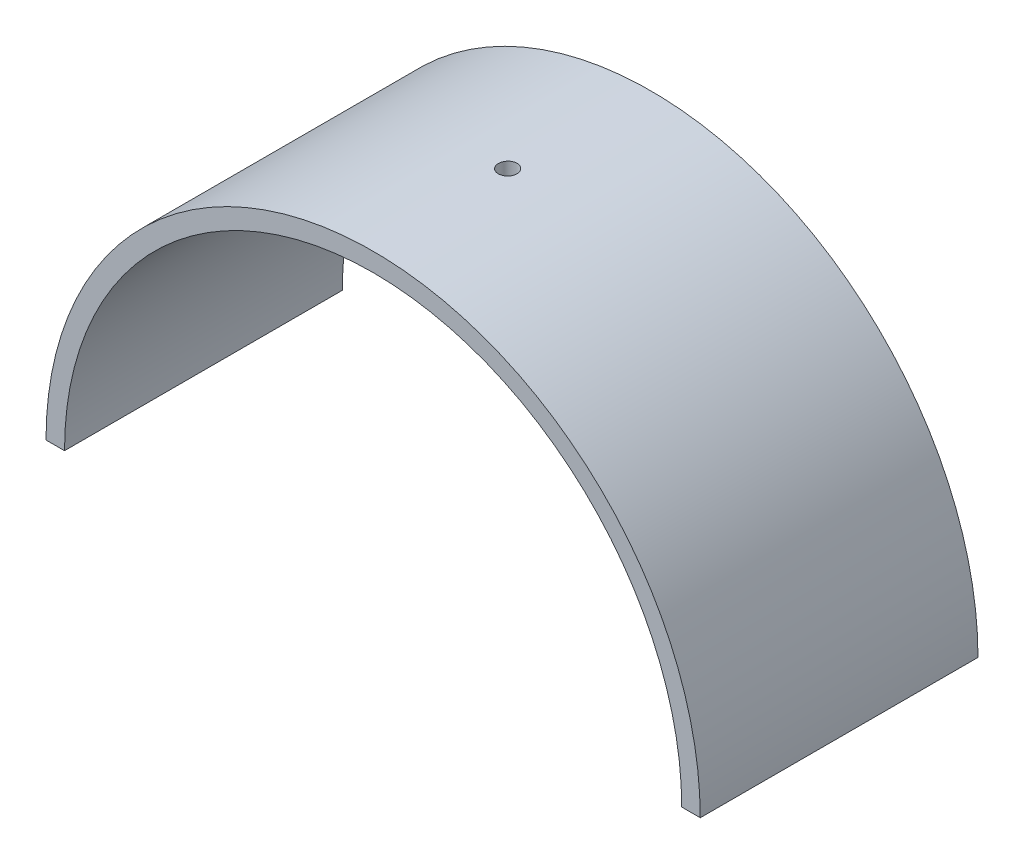
ISO-10303-21;
HEADER;
FILE_DESCRIPTION(('STEP AP214'),'2;1');
FILE_NAME('part.step','',(''),(''),'','','');
FILE_SCHEMA(('AUTOMOTIVE_DESIGN { 1 0 10303 214 1 1 1 1 }'));
ENDSEC;
DATA;
#1=APPLICATION_CONTEXT('core data for automotive mechanical design processes');
#2=APPLICATION_PROTOCOL_DEFINITION('international standard','automotive_design',2000,#1);
#3=PRODUCT_CONTEXT('',#1,'mechanical');
#4=PRODUCT('Part','Part','',(#3));
#5=PRODUCT_RELATED_PRODUCT_CATEGORY('part','',(#4));
#6=PRODUCT_DEFINITION_FORMATION('','',#4);
#7=PRODUCT_DEFINITION_CONTEXT('part definition',#1,'design');
#8=PRODUCT_DEFINITION('design','',#6,#7);
#9=PRODUCT_DEFINITION_SHAPE('','',#8);
#10=(LENGTH_UNIT() NAMED_UNIT(*) SI_UNIT(.MILLI.,.METRE.));
#11=(NAMED_UNIT(*) PLANE_ANGLE_UNIT() SI_UNIT($,.RADIAN.));
#12=(NAMED_UNIT(*) SI_UNIT($,.STERADIAN.) SOLID_ANGLE_UNIT());
#13=UNCERTAINTY_MEASURE_WITH_UNIT(LENGTH_MEASURE(1.E-05),#10,'distance_accuracy_value','');
#14=(GEOMETRIC_REPRESENTATION_CONTEXT(3) GLOBAL_UNCERTAINTY_ASSIGNED_CONTEXT((#13)) GLOBAL_UNIT_ASSIGNED_CONTEXT((#10,
#11,#12)) REPRESENTATION_CONTEXT('',''));
#15=CARTESIAN_POINT('',(0.,0.,0.));
#16=DIRECTION('',(0.,0.,1.));
#17=DIRECTION('',(1.,0.,0.));
#18=AXIS2_PLACEMENT_3D('',#15,#16,#17);
#19=CARTESIAN_POINT('',(-51.5,0.,-27.8343249485573));
#20=DIRECTION('',(0.,0.,-1.));
#21=DIRECTION('',(-1.,0.,0.));
#22=AXIS2_PLACEMENT_3D('',#19,#20,#21);
#23=CYLINDRICAL_SURFACE('',#22,53.);
#24=CARTESIAN_POINT('',(-52.2035451664015,52.9953302112444,1.5));
#25=CARTESIAN_POINT('',(-52.287808076425,52.9942112833112,1.49999626657205));
#26=CARTESIAN_POINT('',(-52.3721290794447,52.9928889966438,1.49287592440333));
#27=CARTESIAN_POINT('',(-52.5384421990418,52.9898912907182,1.46457347770081));
#28=CARTESIAN_POINT('',(-52.6204313978558,52.9882154493729,1.44337449999846));
#29=CARTESIAN_POINT('',(-52.7796478266655,52.9846094620955,1.38752165949672));
#30=CARTESIAN_POINT('',(-52.8568773992233,52.9826794427543,1.35287447782762));
#31=CARTESIAN_POINT('',(-53.0044008015459,52.9786960062936,1.2711182135689));
#32=CARTESIAN_POINT('',(-53.0746963256784,52.9766426195178,1.22401218576601));
#33=CARTESIAN_POINT('',(-53.2064148182024,52.9725636524948,1.11864570661175));
#34=CARTESIAN_POINT('',(-53.2678337831578,52.9705380851648,1.06038024959755));
#35=CARTESIAN_POINT('',(-53.3800203893353,52.9666752062266,0.934357180430867));
#36=CARTESIAN_POINT('',(-53.4307876162332,52.9648379019427,0.866599199215464));
#37=CARTESIAN_POINT('',(-53.520221696735,52.9615021906314,0.723519105316563));
#38=CARTESIAN_POINT('',(-53.5588894776458,52.9600037576351,0.648197572891805));
#39=CARTESIAN_POINT('',(-53.6230282395587,52.9574714965208,0.492123867219286));
#40=CARTESIAN_POINT('',(-53.6484993048682,52.9564376654345,0.411371728668819));
#41=CARTESIAN_POINT('',(-53.6855048254691,52.9549234257782,0.246789061139623));
#42=CARTESIAN_POINT('',(-53.6970489788023,52.9544426321101,0.162960716248393));
#43=CARTESIAN_POINT('',(-53.7059033182207,52.954074547018,-0.00544534766046931));
#44=CARTESIAN_POINT('',(-53.7032135851561,52.9541872522229,-0.0900230624188573));
#45=CARTESIAN_POINT('',(-53.6836826257025,52.9549962100127,-0.257477917744125));
#46=CARTESIAN_POINT('',(-53.6668492127916,52.9556921404023,-0.340355971374241));
#47=CARTESIAN_POINT('',(-53.6195211410663,52.957607445625,-0.502108603759159));
#48=CARTESIAN_POINT('',(-53.5890264484534,52.958826821753,-0.58098317260869));
#49=CARTESIAN_POINT('',(-53.5152335014231,52.9616860653184,-0.732514470051274));
#50=CARTESIAN_POINT('',(-53.4719317709818,52.9633260468984,-0.805169503656206));
#51=CARTESIAN_POINT('',(-53.3737575804674,52.9668900079135,-0.94218129863256));
#52=CARTESIAN_POINT('',(-53.3188850704238,52.968813988575,-1.00653802416424));
#53=CARTESIAN_POINT('',(-53.1990787237241,52.9727922420841,-1.12517800622718));
#54=CARTESIAN_POINT('',(-53.1341372823863,52.9748466127117,-1.17945358017992));
#55=CARTESIAN_POINT('',(-52.9960639822766,52.9789255714166,-1.27633320138429));
#56=CARTESIAN_POINT('',(-52.9229321037941,52.9809501594223,-1.31893722054717));
#57=CARTESIAN_POINT('',(-52.770523430198,52.9848240192361,-1.39127763624885));
#58=CARTESIAN_POINT('',(-52.6912445034965,52.9866732297305,-1.42100954543389));
#59=CARTESIAN_POINT('',(-52.528813466323,52.9900758363333,-1.46673760782664));
#60=CARTESIAN_POINT('',(-52.4456613642062,52.9916292330797,-1.48273379066316));
#61=CARTESIAN_POINT('',(-52.2778750180686,52.9943576818946,-1.50052984144469));
#62=CARTESIAN_POINT('',(-52.1932413049227,52.9955328666683,-1.50233469399686));
#63=CARTESIAN_POINT('',(-52.0248678023833,52.9974678937722,-1.49170707197935));
#64=CARTESIAN_POINT('',(-51.9411280105138,52.9982277372532,-1.47927463685429));
#65=CARTESIAN_POINT('',(-51.7769613848486,52.9993399122833,-1.44053318383438));
#66=CARTESIAN_POINT('',(-51.6965330091322,52.9996924356139,-1.41423070497407));
#67=CARTESIAN_POINT('',(-51.541231323899,53.0000409042563,-1.34849923229043));
#68=CARTESIAN_POINT('',(-51.4663580130335,53.0000368496547,-1.30907024165442));
#69=CARTESIAN_POINT('',(-51.3242946239401,52.9997564222239,-1.21820678619799));
#70=CARTESIAN_POINT('',(-51.2571042497749,52.9994800598876,-1.16677278402813));
#71=CARTESIAN_POINT('',(-51.1323093900185,52.9987613609097,-1.05335801448023));
#72=CARTESIAN_POINT('',(-51.0747049221689,52.9983190239608,-0.991377227582533));
#73=CARTESIAN_POINT('',(-50.9707031243774,52.9973825596723,-0.858611091080073));
#74=CARTESIAN_POINT('',(-50.9243084966751,52.996888419886,-0.787823624758254));
#75=CARTESIAN_POINT('',(-50.8440608835868,52.9959560839993,-0.639464620348494));
#76=CARTESIAN_POINT('',(-50.8102078884307,52.9955178878552,-0.561893087545506));
#77=CARTESIAN_POINT('',(-50.7560022893301,52.9947847192536,-0.402160824188399));
#78=CARTESIAN_POINT('',(-50.7356507548095,52.9944897581421,-0.319999730662943));
#79=CARTESIAN_POINT('',(-50.70903046734,52.9940991725078,-0.153426357672677));
#80=CARTESIAN_POINT('',(-50.7027617293769,52.9940035481972,-0.069014075812441));
#81=CARTESIAN_POINT('',(-50.7044850932602,52.9940294428723,0.0996557890975757));
#82=CARTESIAN_POINT('',(-50.7124756871917,52.9941509388977,0.183913387561822));
#83=CARTESIAN_POINT('',(-50.7424878327766,52.9945883794121,0.349891146834266));
#84=CARTESIAN_POINT('',(-50.7645094154226,52.9949043243308,0.431611302037196));
#85=CARTESIAN_POINT('',(-50.8219586855843,52.9956703866799,0.590196030829827));
#86=CARTESIAN_POINT('',(-50.8573866221805,52.9961205066032,0.667060514173647));
#87=CARTESIAN_POINT('',(-50.940641573015,52.9970644808907,0.813748306073337));
#88=CARTESIAN_POINT('',(-50.9884681163551,52.9975583335935,0.883571881902545));
#89=CARTESIAN_POINT('',(-51.095163223192,52.998480594652,1.01420005030064));
#90=CARTESIAN_POINT('',(-51.1540317940102,52.9989090029644,1.07500463688938));
#91=CARTESIAN_POINT('',(-51.2811593457515,52.9995862266722,1.18588314722011));
#92=CARTESIAN_POINT('',(-51.3494206347037,52.9998349978319,1.23595442575687));
#93=CARTESIAN_POINT('',(-51.4934019311959,53.0000484702756,1.32394134498786));
#94=CARTESIAN_POINT('',(-51.5691248797388,53.0000130591036,1.36185216740115));
#95=CARTESIAN_POINT('',(-51.7258005164037,52.9995766527104,1.42437990875735));
#96=CARTESIAN_POINT('',(-51.80674683252,52.9991760953815,1.44901269475014));
#97=CARTESIAN_POINT('',(-51.9407621582688,52.9981925317537,1.4777487160451));
#98=CARTESIAN_POINT('',(-51.992962864912,52.9977333755274,1.48608264024125));
#99=CARTESIAN_POINT('',(-52.0979498308258,52.9966528413397,1.49720945102635));
#100=CARTESIAN_POINT('',(-52.1507360898648,52.9960314634424,1.50000233980624));
#101=CARTESIAN_POINT('',(-52.2035451664015,52.9953302112444,1.5));
#102=B_SPLINE_CURVE_WITH_KNOTS('',3,(#24,#25,#26,#27,#28,#29,#30,#31,#32,#33,#34,#35,#36,#37,
#38,#39,#40,#41,#42,#43,#44,#45,#46,#47,#48,#49,#50,#51,#52,#53,#54,#55,#56,#57,#58,#59,#60,#61,
#62,#63,#64,#65,#66,#67,#68,#69,#70,#71,#72,#73,#74,#75,#76,#77,#78,#79,#80,#81,#82,#83,#84,#85,
#86,#87,#88,#89,#90,#91,#92,#93,#94,#95,#96,#97,#98,#99,#100,#101),.UNSPECIFIED.,.T.,.F.,(4,2,2,
2,2,2,2,2,2,2,2,2,2,2,2,2,2,2,2,2,2,2,2,2,2,2,2,2,2,2,2,2,2,2,2,2,2,2,4),(0.,0.252618176133932,
0.505539661482403,0.758335654757215,1.01106972230574,1.26391742263958,1.51677495625066,
1.76961310599602,2.02244964045827,2.27511000971895,2.52776894383684,2.78028839175933,
3.03280846442545,3.28539713785457,3.5379869021577,3.79076837565608,4.04355045749235,
4.29642059101838,4.54929017908661,4.80207094448153,5.05485100954516,5.30751200780814,
5.56017294472126,5.81282414616455,6.06547581521163,6.3181883277413,6.57090064340357,
6.82363297351989,7.07636557257234,7.32907144690041,7.58177787942164,7.83448900727849,
8.08719053858936,8.33989223745643,8.59265614280198,8.84552007625448,9.09808116751638,
9.25640157051688,9.41472191091719),.UNSPECIFIED.);
#103=CARTESIAN_POINT('',(-52.2035451664015,52.9953302112444,1.5));
#104=VERTEX_POINT('',#103);
#105=EDGE_CURVE('E92',#104,#104,#102,.T.);
#106=ORIENTED_EDGE('',*,*,#105,.T.);
#107=EDGE_LOOP('',(#106));
#108=FACE_BOUND('',#107,.T.);
#109=CARTESIAN_POINT('',(-51.5,0.,-22.5));
#110=DIRECTION('',(0.,0.,-1.));
#111=DIRECTION('',(-1.,0.,0.));
#112=AXIS2_PLACEMENT_3D('',#109,#110,#111);
#113=CIRCLE('',#112,53.);
#114=CARTESIAN_POINT('',(-104.5,-3.70097021917372E-13,-22.5));
#115=VERTEX_POINT('',#114);
#116=CARTESIAN_POINT('',(1.49999999999999,0.,-22.5));
#117=VERTEX_POINT('',#116);
#118=EDGE_CURVE('E11',#115,#117,#113,.T.);
#119=ORIENTED_EDGE('',*,*,#118,.F.);
#120=DIRECTION('',(0.,0.,-1.));
#121=VECTOR('',#120,1.);
#122=CARTESIAN_POINT('',(-104.5,-3.70097021917372E-13,-22.5));
#123=LINE('',#122,#121);
#124=CARTESIAN_POINT('',(-104.5,-3.70097021917372E-13,22.5));
#125=VERTEX_POINT('',#124);
#126=EDGE_CURVE('E102',#125,#115,#123,.T.);
#127=ORIENTED_EDGE('',*,*,#126,.F.);
#128=CARTESIAN_POINT('',(-51.5,0.,22.5));
#129=DIRECTION('',(0.,0.,-1.));
#130=DIRECTION('',(-1.,0.,0.));
#131=AXIS2_PLACEMENT_3D('',#128,#129,#130);
#132=CIRCLE('',#131,53.);
#133=CARTESIAN_POINT('',(1.5,0.,22.5));
#134=VERTEX_POINT('',#133);
#135=EDGE_CURVE('E53',#125,#134,#132,.T.);
#136=ORIENTED_EDGE('',*,*,#135,.T.);
#137=DIRECTION('',(0.,0.,-1.));
#138=VECTOR('',#137,1.);
#139=CARTESIAN_POINT('',(1.49999999999999,0.,-22.5));
#140=LINE('',#139,#138);
#141=EDGE_CURVE('E89',#134,#117,#140,.T.);
#142=ORIENTED_EDGE('',*,*,#141,.T.);
#143=EDGE_LOOP('',(#119,#127,#136,#142));
#144=FACE_BOUND('',#143,.T.);
#145=ADVANCED_FACE('F33',(#108,#144),#23,.T.);
#146=CARTESIAN_POINT('',(-101.5,-3.49148133884313E-13,-22.5));
#147=DIRECTION('',(0.,0.,1.));
#148=DIRECTION('',(1.,0.,0.));
#149=AXIS2_PLACEMENT_3D('',#146,#147,#148);
#150=PLANE('',#149);
#151=CARTESIAN_POINT('',(-51.5,0.,-22.5));
#152=DIRECTION('',(0.,0.,-1.));
#153=DIRECTION('',(-1.,0.,0.));
#154=AXIS2_PLACEMENT_3D('',#151,#152,#153);
#155=CIRCLE('',#154,50.);
#156=CARTESIAN_POINT('',(-101.5,-3.49148133884313E-13,-22.5));
#157=VERTEX_POINT('',#156);
#158=CARTESIAN_POINT('',(-1.5,0.,-22.5));
#159=VERTEX_POINT('',#158);
#160=EDGE_CURVE('E46',#157,#159,#155,.T.);
#161=ORIENTED_EDGE('',*,*,#160,.F.);
#162=DIRECTION('',(1.,0.,0.));
#163=VECTOR('',#162,1.);
#164=CARTESIAN_POINT('',(-101.5,-3.49148133884313E-13,-22.5));
#165=LINE('',#164,#163);
#166=EDGE_CURVE('E85',#115,#157,#165,.T.);
#167=ORIENTED_EDGE('',*,*,#166,.F.);
#168=ORIENTED_EDGE('',*,*,#118,.T.);
#169=DIRECTION('',(-1.,0.,0.));
#170=VECTOR('',#169,1.);
#171=CARTESIAN_POINT('',(-1.5,0.,-22.5));
#172=LINE('',#171,#170);
#173=EDGE_CURVE('E82',#117,#159,#172,.T.);
#174=ORIENTED_EDGE('',*,*,#173,.T.);
#175=EDGE_LOOP('',(#161,#167,#168,#174));
#176=FACE_BOUND('',#175,.T.);
#177=ADVANCED_FACE('F35',(#176),#150,.F.);
#178=CARTESIAN_POINT('',(-51.5,0.,-27.8343249485573));
#179=DIRECTION('',(0.,0.,-1.));
#180=DIRECTION('',(-1.,0.,0.));
#181=AXIS2_PLACEMENT_3D('',#178,#179,#180);
#182=CYLINDRICAL_SURFACE('',#181,50.);
#183=CARTESIAN_POINT('',(-52.2035451664015,49.995049996963,1.5));
#184=CARTESIAN_POINT('',(-52.1193259401897,49.9962348521856,1.49999627603281));
#185=CARTESIAN_POINT('',(-52.0350432443834,49.9972060745945,1.49288334426168));
#186=CARTESIAN_POINT('',(-51.8687941505923,49.9987092320422,1.46460486512545));
#187=CARTESIAN_POINT('',(-51.7868306289488,49.9992406428494,1.44342260190752));
#188=CARTESIAN_POINT('',(-51.6276525590121,49.9999003718989,1.38760743336938));
#189=CARTESIAN_POINT('',(-51.5504357736492,50.0000288814729,1.35298092130781));
#190=CARTESIAN_POINT('',(-51.4029302528392,49.9999602448707,1.27126861733734));
#191=CARTESIAN_POINT('',(-51.332639833326,49.9997631780625,1.22418586432944));
#192=CARTESIAN_POINT('',(-51.2009439116405,49.9991490954229,1.11888329074234));
#193=CARTESIAN_POINT('',(-51.1395401112388,49.9987320375343,1.0606613419722));
#194=CARTESIAN_POINT('',(-51.0273736051999,49.9977977385219,0.934735542739224));
#195=CARTESIAN_POINT('',(-50.9766113242207,49.9972804934016,0.867031314058561));
#196=CARTESIAN_POINT('',(-50.8871598209403,49.9962642182107,0.724046154245327));
#197=CARTESIAN_POINT('',(-50.8484734577306,49.9957651924783,0.648763434402125));
#198=CARTESIAN_POINT('',(-50.7842883838997,49.9948876698089,0.49277124446977));
#199=CARTESIAN_POINT('',(-50.7587896447484,49.9945091726111,0.412061786121253));
#200=CARTESIAN_POINT('',(-50.7217038153712,49.9939456603108,0.247506818952541));
#201=CARTESIAN_POINT('',(-50.7101167334086,49.9937606453233,0.163661308269606));
#202=CARTESIAN_POINT('',(-50.7011835022023,49.9936187236246,-0.00478496149290249));
#203=CARTESIAN_POINT('',(-50.703837317766,49.9936618163497,-0.0893857187055687));
#204=CARTESIAN_POINT('',(-50.723309291482,49.9939680796112,-0.256931194726332));
#205=CARTESIAN_POINT('',(-50.7401258817927,49.9942312257872,-0.339876095799908));
#206=CARTESIAN_POINT('',(-50.7874437379677,49.9949279305196,-0.50176543309376));
#207=CARTESIAN_POINT('',(-50.8179450281702,49.9953614893791,-0.580709862198901));
#208=CARTESIAN_POINT('',(-50.8917687168365,49.9963139710278,-0.732362696205846));
#209=CARTESIAN_POINT('',(-50.9350919048806,49.9968328990734,-0.805070716710021));
#210=CARTESIAN_POINT('',(-51.0333293144496,49.9978461854979,-0.942182257244601));
#211=CARTESIAN_POINT('',(-51.088243539964,49.9983405438684,-1.00658577441665));
#212=CARTESIAN_POINT('',(-51.2081101403882,49.9991838347651,-1.1252657176085));
#213=CARTESIAN_POINT('',(-51.2730633719636,49.999532754871,-1.17954127849897));
#214=CARTESIAN_POINT('',(-51.4111608527303,49.9999686722027,-1.27641726625066));
#215=CARTESIAN_POINT('',(-51.4843050911436,50.0000556697731,-1.31901770847419));
#216=CARTESIAN_POINT('',(-51.6366936281424,49.9998711267626,-1.39132698581661));
#217=CARTESIAN_POINT('',(-51.715936832985,49.9995996503274,-1.42103812609319));
#218=CARTESIAN_POINT('',(-51.8782836939031,49.9986348439188,-1.46673656709737));
#219=CARTESIAN_POINT('',(-51.9613873419804,49.9979415148194,-1.4827238962573));
#220=CARTESIAN_POINT('',(-52.1290746390798,49.9961127717684,-1.50052039264119));
#221=CARTESIAN_POINT('',(-52.2136579395635,49.9949774606233,-1.50233285492055));
#222=CARTESIAN_POINT('',(-52.3819227347573,49.9922923406458,-1.49173985481024));
#223=CARTESIAN_POINT('',(-52.4656042283576,49.9907425313034,-1.47933437492294));
#224=CARTESIAN_POINT('',(-52.6297100897466,49.9873033483311,-1.44065667752664));
#225=CARTESIAN_POINT('',(-52.7101337620347,49.9854139026567,-1.41438151565286));
#226=CARTESIAN_POINT('',(-52.8654268717149,49.9814130321997,-1.34871044007473));
#227=CARTESIAN_POINT('',(-52.9402962868157,49.9793016065263,-1.30931447371534));
#228=CARTESIAN_POINT('',(-53.0824027518741,49.9750044064327,-1.2184925821813));
#229=CARTESIAN_POINT('',(-53.1496353378468,49.9728185894886,-1.16705967421166));
#230=CARTESIAN_POINT('',(-53.2745123441994,49.9685402798822,-1.05363383230028));
#231=CARTESIAN_POINT('',(-53.3321567431362,49.9664477874286,-0.991640874742589));
#232=CARTESIAN_POINT('',(-53.4362315332902,49.9625232360009,-0.858837988062242));
#233=CARTESIAN_POINT('',(-53.4826597632112,49.9606912272486,-0.788026363606813));
#234=CARTESIAN_POINT('',(-53.5629665384823,49.957439799284,-0.639603819904402));
#235=CARTESIAN_POINT('',(-53.5968451446005,49.956020378074,-0.561992933583187));
#236=CARTESIAN_POINT('',(-53.6510694824672,49.9537149899815,-0.402225574771671));
#237=CARTESIAN_POINT('',(-53.6714235892197,49.9528286929958,-0.320071949568081));
#238=CARTESIAN_POINT('',(-53.6980510373201,49.9516641564217,-0.153509401651158));
#239=CARTESIAN_POINT('',(-53.7043244287794,49.9513859146693,-0.0691004869651725));
#240=CARTESIAN_POINT('',(-53.7026118274594,49.9514614563333,0.099505092238527));
#241=CARTESIAN_POINT('',(-53.6946371282655,49.951814739179,0.183701871934228));
#242=CARTESIAN_POINT('',(-53.6646780723142,49.9531219305944,0.349560099409172));
#243=CARTESIAN_POINT('',(-53.6426936939751,49.9540758400893,0.431221543282563));
#244=CARTESIAN_POINT('',(-53.5853417994642,49.9565027583057,0.589693928579172));
#245=CARTESIAN_POINT('',(-53.5499740932053,49.9579757744002,0.666504801090283));
#246=CARTESIAN_POINT('',(-53.466862875325,49.9613167610294,0.813097340474249));
#247=CARTESIAN_POINT('',(-53.4191197848018,49.9631847181251,0.882879246410172));
#248=CARTESIAN_POINT('',(-53.3125755631509,49.9671632739663,1.01348873669518));
#249=CARTESIAN_POINT('',(-53.2537669057729,49.9692740374746,1.07431017608166));
#250=CARTESIAN_POINT('',(-53.1267608094507,49.9735697901974,1.18523510949101));
#251=CARTESIAN_POINT('',(-53.0585610244416,49.9757547978562,1.23533591730353));
#252=CARTESIAN_POINT('',(-52.914646780036,49.9800356064533,1.32342864404695));
#253=CARTESIAN_POINT('',(-52.8389241423904,49.9821313066889,1.36140719148956));
#254=CARTESIAN_POINT('',(-52.6822297228884,49.9860825577669,1.42406628245486));
#255=CARTESIAN_POINT('',(-52.6012643199939,49.987938392513,1.4487626582385));
#256=CARTESIAN_POINT('',(-52.4670814479408,49.9906736461962,1.47761984619883));
#257=CARTESIAN_POINT('',(-52.4147362402565,49.9916595961494,1.48600164849656));
#258=CARTESIAN_POINT('',(-52.309450778192,49.993475194606,1.49719289627467));
#259=CARTESIAN_POINT('',(-52.2565105238378,49.9943048431164,1.50000234199793));
#260=CARTESIAN_POINT('',(-52.2035451664015,49.995049996963,1.5));
#261=B_SPLINE_CURVE_WITH_KNOTS('',3,(#183,#184,#185,#186,#187,#188,#189,#190,#191,#192,#193,
#194,#195,#196,#197,#198,#199,#200,#201,#202,#203,#204,#205,#206,#207,#208,#209,#210,#211,#212,
#213,#214,#215,#216,#217,#218,#219,#220,#221,#222,#223,#224,#225,#226,#227,#228,#229,#230,#231,
#232,#233,#234,#235,#236,#237,#238,#239,#240,#241,#242,#243,#244,#245,#246,#247,#248,#249,#250,
#251,#252,#253,#254,#255,#256,#257,#258,#259,#260),.UNSPECIFIED.,.T.,.F.,(4,2,2,2,2,2,2,2,2,2,2,
2,2,2,2,2,2,2,2,2,2,2,2,2,2,2,2,2,2,2,2,2,2,2,2,2,2,2,4),(0.,0.252489424037495,
0.505279370085873,0.75794925171175,1.01055754719556,1.26321415285445,1.51588083904898,
1.76860730125463,2.02133321670944,2.27405928227976,2.52678472330487,2.77948219090126,
3.03218010792312,3.28489358947707,3.53760715801303,3.79034230345251,4.04307711633745,
4.2957667107914,4.54845578173437,4.80108611143857,5.05371675204829,5.30640104465114,
5.55908635131233,5.81191860914148,6.06475143239909,6.3176329364119,6.57051321590099,
6.82323675376305,7.07595939221547,7.32848180183526,7.58100460046325,7.83353098587798,
8.08604877968398,8.33873894850678,8.59149235858225,8.84452361307359,9.0972525837167,
9.2560428478574,9.41483310507701),.UNSPECIFIED.);
#262=CARTESIAN_POINT('',(-52.2035451664015,49.995049996963,1.5));
#263=VERTEX_POINT('',#262);
#264=EDGE_CURVE('E37',#263,#263,#261,.T.);
#265=ORIENTED_EDGE('',*,*,#264,.T.);
#266=EDGE_LOOP('',(#265));
#267=FACE_BOUND('',#266,.T.);
#268=CARTESIAN_POINT('',(-51.5,0.,22.5));
#269=DIRECTION('',(0.,0.,-1.));
#270=DIRECTION('',(-1.,0.,0.));
#271=AXIS2_PLACEMENT_3D('',#268,#269,#270);
#272=CIRCLE('',#271,50.);
#273=CARTESIAN_POINT('',(-101.5,-3.49148133884313E-13,22.5));
#274=VERTEX_POINT('',#273);
#275=CARTESIAN_POINT('',(-1.49999999999999,0.,22.5));
#276=VERTEX_POINT('',#275);
#277=EDGE_CURVE('E61',#274,#276,#272,.T.);
#278=ORIENTED_EDGE('',*,*,#277,.F.);
#279=DIRECTION('',(0.,0.,1.));
#280=VECTOR('',#279,1.);
#281=CARTESIAN_POINT('',(-101.5,-3.49148133884313E-13,-22.5));
#282=LINE('',#281,#280);
#283=EDGE_CURVE('E105',#157,#274,#282,.T.);
#284=ORIENTED_EDGE('',*,*,#283,.F.);
#285=ORIENTED_EDGE('',*,*,#160,.T.);
#286=DIRECTION('',(0.,0.,1.));
#287=VECTOR('',#286,1.);
#288=CARTESIAN_POINT('',(-1.5,0.,-22.5));
#289=LINE('',#288,#287);
#290=EDGE_CURVE('E95',#159,#276,#289,.T.);
#291=ORIENTED_EDGE('',*,*,#290,.T.);
#292=EDGE_LOOP('',(#278,#284,#285,#291));
#293=FACE_BOUND('',#292,.T.);
#294=ADVANCED_FACE('F112',(#267,#293),#182,.F.);
#295=CARTESIAN_POINT('',(-101.5,-3.49148133884313E-13,22.5));
#296=DIRECTION('',(0.,0.,-1.));
#297=DIRECTION('',(-1.,0.,0.));
#298=AXIS2_PLACEMENT_3D('',#295,#296,#297);
#299=PLANE('',#298);
#300=DIRECTION('',(-1.,0.,0.));
#301=VECTOR('',#300,1.);
#302=CARTESIAN_POINT('',(-101.5,-3.49148133884313E-13,22.5));
#303=LINE('',#302,#301);
#304=EDGE_CURVE('E107',#274,#125,#303,.T.);
#305=ORIENTED_EDGE('',*,*,#304,.F.);
#306=ORIENTED_EDGE('',*,*,#277,.T.);
#307=DIRECTION('',(1.,0.,0.));
#308=VECTOR('',#307,1.);
#309=CARTESIAN_POINT('',(-1.49999999999999,0.,22.5));
#310=LINE('',#309,#308);
#311=EDGE_CURVE('E97',#276,#134,#310,.T.);
#312=ORIENTED_EDGE('',*,*,#311,.T.);
#313=ORIENTED_EDGE('',*,*,#135,.F.);
#314=EDGE_LOOP('',(#305,#306,#312,#313));
#315=FACE_BOUND('',#314,.T.);
#316=ADVANCED_FACE('F115',(#315),#299,.F.);
#317=CARTESIAN_POINT('',(-103.,-3.59622577900843E-13,0.));
#318=DIRECTION('',(0.,-1.,0.));
#319=DIRECTION('',(0.,0.,1.));
#320=AXIS2_PLACEMENT_3D('',#317,#318,#319);
#321=PLANE('',#320);
#322=ORIENTED_EDGE('',*,*,#126,.T.);
#323=ORIENTED_EDGE('',*,*,#166,.T.);
#324=ORIENTED_EDGE('',*,*,#283,.T.);
#325=ORIENTED_EDGE('',*,*,#304,.T.);
#326=EDGE_LOOP('',(#322,#323,#324,#325));
#327=FACE_BOUND('',#326,.T.);
#328=ADVANCED_FACE('F114',(#327),#321,.T.);
#329=CARTESIAN_POINT('',(0.,0.,0.));
#330=DIRECTION('',(0.,1.,0.));
#331=DIRECTION('',(0.,0.,1.));
#332=AXIS2_PLACEMENT_3D('',#329,#330,#331);
#333=PLANE('',#332);
#334=ORIENTED_EDGE('',*,*,#141,.F.);
#335=ORIENTED_EDGE('',*,*,#311,.F.);
#336=ORIENTED_EDGE('',*,*,#290,.F.);
#337=ORIENTED_EDGE('',*,*,#173,.F.);
#338=EDGE_LOOP('',(#334,#335,#336,#337));
#339=FACE_BOUND('',#338,.T.);
#340=ADVANCED_FACE('F94',(#339),#333,.F.);
#341=CARTESIAN_POINT('',(-52.2035451664015,44.,0.));
#342=DIRECTION('',(0.,1.,0.));
#343=DIRECTION('',(0.,0.,1.));
#344=AXIS2_PLACEMENT_3D('',#341,#342,#343);
#345=CYLINDRICAL_SURFACE('',#344,1.5);
#346=ORIENTED_EDGE('',*,*,#264,.F.);
#347=EDGE_LOOP('',(#346));
#348=FACE_BOUND('',#347,.T.);
#349=ORIENTED_EDGE('',*,*,#105,.F.);
#350=EDGE_LOOP('',(#349));
#351=FACE_BOUND('',#350,.T.);
#352=ADVANCED_FACE('F138',(#348,#351),#345,.F.);
#353=CLOSED_SHELL('',(#145,#177,#294,#316,#328,#340,#352));
#354=MANIFOLD_SOLID_BREP('B2',#353);
#355=ADVANCED_BREP_SHAPE_REPRESENTATION('',(#18,#354),#14);
#356=SHAPE_DEFINITION_REPRESENTATION(#9,#355);
ENDSEC;
END-ISO-10303-21;
